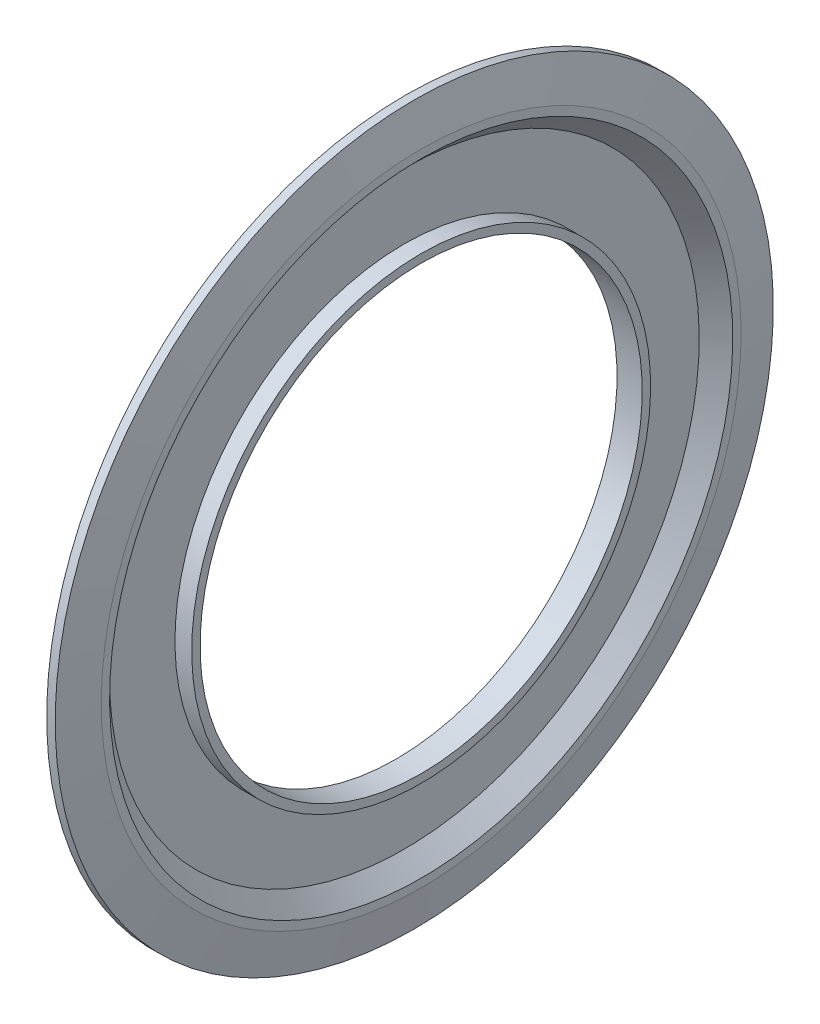
ISO-10303-21;
HEADER;
FILE_DESCRIPTION(('STEP AP214'),'2;1');
FILE_NAME('part.step','',(''),(''),'','','');
FILE_SCHEMA(('AUTOMOTIVE_DESIGN { 1 0 10303 214 1 1 1 1 }'));
ENDSEC;
DATA;
#1=APPLICATION_CONTEXT('core data for automotive mechanical design processes');
#2=APPLICATION_PROTOCOL_DEFINITION('international standard','automotive_design',2000,#1);
#3=PRODUCT_CONTEXT('',#1,'mechanical');
#4=PRODUCT('Part','Part','',(#3));
#5=PRODUCT_RELATED_PRODUCT_CATEGORY('part','',(#4));
#6=PRODUCT_DEFINITION_FORMATION('','',#4);
#7=PRODUCT_DEFINITION_CONTEXT('part definition',#1,'design');
#8=PRODUCT_DEFINITION('design','',#6,#7);
#9=PRODUCT_DEFINITION_SHAPE('','',#8);
#10=(LENGTH_UNIT() NAMED_UNIT(*) SI_UNIT(.MILLI.,.METRE.));
#11=(NAMED_UNIT(*) PLANE_ANGLE_UNIT() SI_UNIT($,.RADIAN.));
#12=(NAMED_UNIT(*) SI_UNIT($,.STERADIAN.) SOLID_ANGLE_UNIT());
#13=UNCERTAINTY_MEASURE_WITH_UNIT(LENGTH_MEASURE(1.E-05),#10,'distance_accuracy_value','');
#14=(GEOMETRIC_REPRESENTATION_CONTEXT(3) GLOBAL_UNCERTAINTY_ASSIGNED_CONTEXT((#13)) GLOBAL_UNIT_ASSIGNED_CONTEXT((#10,
#11,#12)) REPRESENTATION_CONTEXT('',''));
#15=CARTESIAN_POINT('',(0.,0.,0.));
#16=DIRECTION('',(0.,0.,1.));
#17=DIRECTION('',(1.,0.,0.));
#18=AXIS2_PLACEMENT_3D('',#15,#16,#17);
#19=CARTESIAN_POINT('',(0.528141679950118,5.083,0.));
#20=DIRECTION('',(1.,0.,0.));
#21=DIRECTION('',(0.,-1.,0.));
#22=AXIS2_PLACEMENT_3D('',#19,#20,#21);
#23=PLANE('',#22);
#24=CARTESIAN_POINT('',(0.528141679950118,0.,0.));
#25=DIRECTION('',(-1.,0.,0.));
#26=DIRECTION('',(0.,1.,0.));
#27=AXIS2_PLACEMENT_3D('',#24,#25,#26);
#28=CIRCLE('',#27,5.016);
#29=CARTESIAN_POINT('',(0.528141679950118,5.016,0.));
#30=VERTEX_POINT('',#29);
#31=EDGE_CURVE('E11',#30,#30,#28,.T.);
#32=ORIENTED_EDGE('',*,*,#31,.T.);
#33=EDGE_LOOP('',(#32));
#34=FACE_BOUND('',#33,.T.);
#35=CARTESIAN_POINT('',(0.528141679950118,0.,0.));
#36=DIRECTION('',(-1.,0.,0.));
#37=DIRECTION('',(0.,1.,0.));
#38=AXIS2_PLACEMENT_3D('',#35,#36,#37);
#39=CIRCLE('',#38,5.15);
#40=CARTESIAN_POINT('',(0.528141679950118,5.15,0.));
#41=VERTEX_POINT('',#40);
#42=EDGE_CURVE('E74',#41,#41,#39,.T.);
#43=ORIENTED_EDGE('',*,*,#42,.F.);
#44=EDGE_LOOP('',(#43));
#45=FACE_BOUND('',#44,.T.);
#46=ADVANCED_FACE('F16',(#34,#45),#23,.T.);
#47=CARTESIAN_POINT('',(0.393141679950119,0.,0.));
#48=DIRECTION('',(1.,0.,0.));
#49=DIRECTION('',(0.,1.,0.));
#50=AXIS2_PLACEMENT_3D('',#47,#48,#49);
#51=CONICAL_SURFACE('',#50,4.881,0.785398163397448);
#52=CARTESIAN_POINT('',(0.258141679950118,0.,0.));
#53=DIRECTION('',(-1.,0.,0.));
#54=DIRECTION('',(0.,1.,0.));
#55=AXIS2_PLACEMENT_3D('',#52,#53,#54);
#56=CIRCLE('',#55,4.746);
#57=CARTESIAN_POINT('',(0.258141679950118,4.746,0.));
#58=VERTEX_POINT('',#57);
#59=EDGE_CURVE('E20',#58,#58,#56,.T.);
#60=ORIENTED_EDGE('',*,*,#59,.T.);
#61=EDGE_LOOP('',(#60));
#62=FACE_BOUND('',#61,.T.);
#63=ORIENTED_EDGE('',*,*,#31,.F.);
#64=EDGE_LOOP('',(#63));
#65=FACE_BOUND('',#64,.T.);
#66=ADVANCED_FACE('F95',(#62,#65),#51,.F.);
#67=CARTESIAN_POINT('',(0.258141679950118,4.219875,0.));
#68=DIRECTION('',(1.,0.,0.));
#69=DIRECTION('',(0.,-1.,0.));
#70=AXIS2_PLACEMENT_3D('',#67,#68,#69);
#71=PLANE('',#70);
#72=CARTESIAN_POINT('',(0.258141679950118,0.,0.));
#73=DIRECTION('',(-1.,0.,0.));
#74=DIRECTION('',(0.,1.,0.));
#75=AXIS2_PLACEMENT_3D('',#72,#73,#74);
#76=CIRCLE('',#75,3.69375);
#77=CARTESIAN_POINT('',(0.258141679950118,3.69375,0.));
#78=VERTEX_POINT('',#77);
#79=EDGE_CURVE('E78',#78,#78,#76,.T.);
#80=ORIENTED_EDGE('',*,*,#79,.T.);
#81=EDGE_LOOP('',(#80));
#82=FACE_BOUND('',#81,.T.);
#83=ORIENTED_EDGE('',*,*,#59,.F.);
#84=EDGE_LOOP('',(#83));
#85=FACE_BOUND('',#84,.T.);
#86=ADVANCED_FACE('F101',(#82,#85),#71,.T.);
#87=CARTESIAN_POINT('',(0.393141679950119,0.,0.));
#88=DIRECTION('',(1.,0.,0.));
#89=DIRECTION('',(0.,1.,0.));
#90=AXIS2_PLACEMENT_3D('',#87,#88,#89);
#91=CYLINDRICAL_SURFACE('',#90,3.69375);
#92=CARTESIAN_POINT('',(0.528141679950118,0.,0.));
#93=DIRECTION('',(-1.,0.,0.));
#94=DIRECTION('',(0.,1.,0.));
#95=AXIS2_PLACEMENT_3D('',#92,#93,#94);
#96=CIRCLE('',#95,3.69375);
#97=CARTESIAN_POINT('',(0.528141679950118,3.69375,0.));
#98=VERTEX_POINT('',#97);
#99=EDGE_CURVE('E81',#98,#98,#96,.T.);
#100=ORIENTED_EDGE('',*,*,#99,.T.);
#101=EDGE_LOOP('',(#100));
#102=FACE_BOUND('',#101,.T.);
#103=ORIENTED_EDGE('',*,*,#79,.F.);
#104=EDGE_LOOP('',(#103));
#105=FACE_BOUND('',#104,.T.);
#106=ADVANCED_FACE('F110',(#102,#105),#91,.T.);
#107=CARTESIAN_POINT('',(0.528141679950118,3.62625,0.));
#108=DIRECTION('',(1.,0.,0.));
#109=DIRECTION('',(0.,-1.,0.));
#110=AXIS2_PLACEMENT_3D('',#107,#108,#109);
#111=PLANE('',#110);
#112=CARTESIAN_POINT('',(0.528141679950118,0.,0.));
#113=DIRECTION('',(-1.,0.,0.));
#114=DIRECTION('',(0.,1.,0.));
#115=AXIS2_PLACEMENT_3D('',#112,#113,#114);
#116=CIRCLE('',#115,3.55875);
#117=CARTESIAN_POINT('',(0.528141679950118,3.55875,0.));
#118=VERTEX_POINT('',#117);
#119=EDGE_CURVE('E83',#118,#118,#116,.T.);
#120=ORIENTED_EDGE('',*,*,#119,.T.);
#121=EDGE_LOOP('',(#120));
#122=FACE_BOUND('',#121,.T.);
#123=ORIENTED_EDGE('',*,*,#99,.F.);
#124=EDGE_LOOP('',(#123));
#125=FACE_BOUND('',#124,.T.);
#126=ADVANCED_FACE('F113',(#122,#125),#111,.T.);
#127=CARTESIAN_POINT('',(0.325641679950119,0.,0.));
#128=DIRECTION('',(1.,0.,0.));
#129=DIRECTION('',(0.,1.,0.));
#130=AXIS2_PLACEMENT_3D('',#127,#128,#129);
#131=CYLINDRICAL_SURFACE('',#130,3.55875);
#132=CARTESIAN_POINT('',(0.123141679950119,0.,0.));
#133=DIRECTION('',(-1.,0.,0.));
#134=DIRECTION('',(0.,1.,0.));
#135=AXIS2_PLACEMENT_3D('',#132,#133,#134);
#136=CIRCLE('',#135,3.55875);
#137=CARTESIAN_POINT('',(0.123141679950119,3.55875,0.));
#138=VERTEX_POINT('',#137);
#139=EDGE_CURVE('E47',#138,#138,#136,.T.);
#140=ORIENTED_EDGE('',*,*,#139,.T.);
#141=EDGE_LOOP('',(#140));
#142=FACE_BOUND('',#141,.T.);
#143=ORIENTED_EDGE('',*,*,#119,.F.);
#144=EDGE_LOOP('',(#143));
#145=FACE_BOUND('',#144,.T.);
#146=ADVANCED_FACE('F115',(#142,#145),#131,.F.);
#147=CARTESIAN_POINT('',(0.123141679950119,4.18033441546019,0.));
#148=DIRECTION('',(-1.,0.,0.));
#149=DIRECTION('',(0.,1.,0.));
#150=AXIS2_PLACEMENT_3D('',#147,#148,#149);
#151=PLANE('',#150);
#152=CARTESIAN_POINT('',(0.123141679950119,0.,0.));
#153=DIRECTION('',(-1.,0.,0.));
#154=DIRECTION('',(0.,1.,0.));
#155=AXIS2_PLACEMENT_3D('',#152,#153,#154);
#156=CIRCLE('',#155,4.80191883092037);
#157=CARTESIAN_POINT('',(0.123141679950119,4.80191883092037,0.));
#158=VERTEX_POINT('',#157);
#159=EDGE_CURVE('E56',#158,#158,#156,.T.);
#160=ORIENTED_EDGE('',*,*,#159,.T.);
#161=EDGE_LOOP('',(#160));
#162=FACE_BOUND('',#161,.T.);
#163=ORIENTED_EDGE('',*,*,#139,.F.);
#164=EDGE_LOOP('',(#163));
#165=FACE_BOUND('',#164,.T.);
#166=ADVANCED_FACE('F18',(#162,#165),#151,.T.);
#167=CARTESIAN_POINT('',(0.258141679950118,0.,0.));
#168=DIRECTION('',(1.,0.,0.));
#169=DIRECTION('',(0.,1.,0.));
#170=AXIS2_PLACEMENT_3D('',#167,#168,#169);
#171=CONICAL_SURFACE('',#170,4.93691883092037,0.785398163397447);
#172=CARTESIAN_POINT('',(0.393141679950119,0.,0.));
#173=DIRECTION('',(-1.,0.,0.));
#174=DIRECTION('',(0.,1.,0.));
#175=AXIS2_PLACEMENT_3D('',#172,#173,#174);
#176=CIRCLE('',#175,5.07191883092037);
#177=CARTESIAN_POINT('',(0.393141679950119,5.07191883092037,0.));
#178=VERTEX_POINT('',#177);
#179=EDGE_CURVE('E72',#178,#178,#176,.T.);
#180=ORIENTED_EDGE('',*,*,#179,.T.);
#181=EDGE_LOOP('',(#180));
#182=FACE_BOUND('',#181,.T.);
#183=ORIENTED_EDGE('',*,*,#159,.F.);
#184=EDGE_LOOP('',(#183));
#185=FACE_BOUND('',#184,.T.);
#186=ADVANCED_FACE('F118',(#182,#185),#171,.T.);
#187=CARTESIAN_POINT('',(0.393141679950119,5.10505393067218,0.));
#188=DIRECTION('',(-1.,0.,0.));
#189=DIRECTION('',(0.,1.,0.));
#190=AXIS2_PLACEMENT_3D('',#187,#188,#189);
#191=PLANE('',#190);
#192=CARTESIAN_POINT('',(0.393141679950119,0.,0.));
#193=DIRECTION('',(-1.,0.,0.));
#194=DIRECTION('',(0.,1.,0.));
#195=AXIS2_PLACEMENT_3D('',#192,#193,#194);
#196=CIRCLE('',#195,5.138189030424);
#197=CARTESIAN_POINT('',(0.393141679950119,5.138189030424,0.));
#198=VERTEX_POINT('',#197);
#199=EDGE_CURVE('E68',#198,#198,#196,.T.);
#200=ORIENTED_EDGE('',*,*,#199,.T.);
#201=EDGE_LOOP('',(#200));
#202=FACE_BOUND('',#201,.T.);
#203=ORIENTED_EDGE('',*,*,#179,.F.);
#204=EDGE_LOOP('',(#203));
#205=FACE_BOUND('',#204,.T.);
#206=ADVANCED_FACE('F69',(#202,#205),#191,.T.);
#207=CARTESIAN_POINT('',(0.336557384724665,0.,0.));
#208=DIRECTION('',(-1.,0.,0.));
#209=DIRECTION('',(0.,1.,0.));
#210=AXIS2_PLACEMENT_3D('',#207,#208,#209);
#211=CONICAL_SURFACE('',#210,5.459094515212,1.39626340159546);
#212=CARTESIAN_POINT('',(0.27997308949921,0.,0.));
#213=DIRECTION('',(-1.,0.,0.));
#214=DIRECTION('',(0.,1.,0.));
#215=AXIS2_PLACEMENT_3D('',#212,#213,#214);
#216=CIRCLE('',#215,5.78);
#217=CARTESIAN_POINT('',(0.27997308949921,5.78,0.));
#218=VERTEX_POINT('',#217);
#219=EDGE_CURVE('E64',#218,#218,#216,.T.);
#220=ORIENTED_EDGE('',*,*,#219,.T.);
#221=EDGE_LOOP('',(#220));
#222=FACE_BOUND('',#221,.T.);
#223=ORIENTED_EDGE('',*,*,#199,.F.);
#224=EDGE_LOOP('',(#223));
#225=FACE_BOUND('',#224,.T.);
#226=ADVANCED_FACE('F123',(#222,#225),#211,.F.);
#227=CARTESIAN_POINT('',(0.348514385801498,0.,0.));
#228=DIRECTION('',(1.,0.,0.));
#229=DIRECTION('',(0.,1.,0.));
#230=AXIS2_PLACEMENT_3D('',#227,#228,#229);
#231=CYLINDRICAL_SURFACE('',#230,5.78);
#232=CARTESIAN_POINT('',(0.417055682103786,0.,0.));
#233=DIRECTION('',(-1.,0.,0.));
#234=DIRECTION('',(0.,1.,0.));
#235=AXIS2_PLACEMENT_3D('',#232,#233,#234);
#236=CIRCLE('',#235,5.78);
#237=CARTESIAN_POINT('',(0.417055682103786,5.78,0.));
#238=VERTEX_POINT('',#237);
#239=EDGE_CURVE('E84',#238,#238,#236,.T.);
#240=ORIENTED_EDGE('',*,*,#239,.T.);
#241=EDGE_LOOP('',(#240));
#242=FACE_BOUND('',#241,.T.);
#243=ORIENTED_EDGE('',*,*,#219,.F.);
#244=EDGE_LOOP('',(#243));
#245=FACE_BOUND('',#244,.T.);
#246=ADVANCED_FACE('F109',(#242,#245),#231,.T.);
#247=CARTESIAN_POINT('',(0.472598681026952,0.,0.));
#248=DIRECTION('',(-1.,0.,0.));
#249=DIRECTION('',(0.,1.,0.));
#250=AXIS2_PLACEMENT_3D('',#247,#248,#249);
#251=CONICAL_SURFACE('',#250,5.465,1.39626340159546);
#252=ORIENTED_EDGE('',*,*,#42,.T.);
#253=EDGE_LOOP('',(#252));
#254=FACE_BOUND('',#253,.T.);
#255=ORIENTED_EDGE('',*,*,#239,.F.);
#256=EDGE_LOOP('',(#255));
#257=FACE_BOUND('',#256,.T.);
#258=ADVANCED_FACE('F91',(#254,#257),#251,.T.);
#259=CLOSED_SHELL('',(#46,#66,#86,#106,#126,#146,#166,#186,#206,#226,#246,#258));
#260=MANIFOLD_SOLID_BREP('B1',#259);
#261=ADVANCED_BREP_SHAPE_REPRESENTATION('',(#18,#260),#14);
#262=SHAPE_DEFINITION_REPRESENTATION(#9,#261);
ENDSEC;
END-ISO-10303-21;
